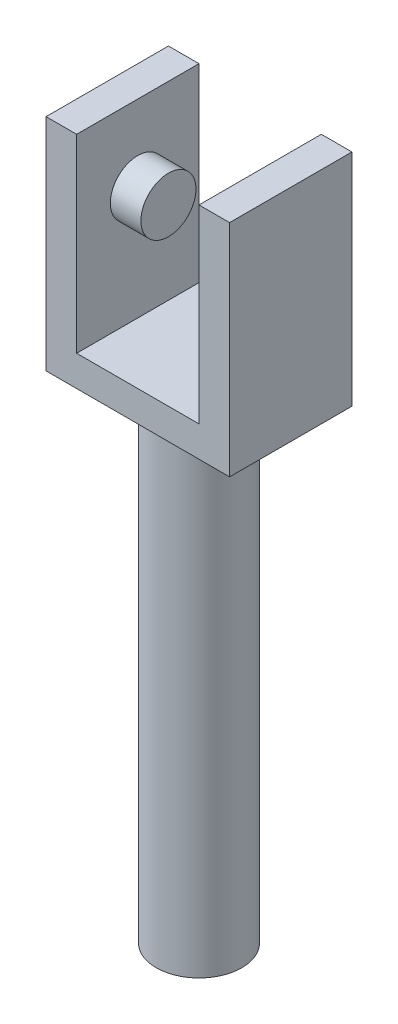
ISO-10303-21;
HEADER;
FILE_DESCRIPTION(('STEP AP214'),'2;1');
FILE_NAME('part.step','',(''),(''),'','','');
FILE_SCHEMA(('AUTOMOTIVE_DESIGN { 1 0 10303 214 1 1 1 1 }'));
ENDSEC;
DATA;
#1=APPLICATION_CONTEXT('core data for automotive mechanical design processes');
#2=APPLICATION_PROTOCOL_DEFINITION('international standard','automotive_design',2000,#1);
#3=PRODUCT_CONTEXT('',#1,'mechanical');
#4=PRODUCT('Part','Part','',(#3));
#5=PRODUCT_RELATED_PRODUCT_CATEGORY('part','',(#4));
#6=PRODUCT_DEFINITION_FORMATION('','',#4);
#7=PRODUCT_DEFINITION_CONTEXT('part definition',#1,'design');
#8=PRODUCT_DEFINITION('design','',#6,#7);
#9=PRODUCT_DEFINITION_SHAPE('','',#8);
#10=(LENGTH_UNIT() NAMED_UNIT(*) SI_UNIT(.MILLI.,.METRE.));
#11=(NAMED_UNIT(*) PLANE_ANGLE_UNIT() SI_UNIT($,.RADIAN.));
#12=(NAMED_UNIT(*) SI_UNIT($,.STERADIAN.) SOLID_ANGLE_UNIT());
#13=UNCERTAINTY_MEASURE_WITH_UNIT(LENGTH_MEASURE(1.E-05),#10,'distance_accuracy_value','');
#14=(GEOMETRIC_REPRESENTATION_CONTEXT(3) GLOBAL_UNCERTAINTY_ASSIGNED_CONTEXT((#13)) GLOBAL_UNIT_ASSIGNED_CONTEXT((#10,
#11,#12)) REPRESENTATION_CONTEXT('',''));
#15=CARTESIAN_POINT('',(0.,0.,0.));
#16=DIRECTION('',(0.,0.,1.));
#17=DIRECTION('',(1.,0.,0.));
#18=AXIS2_PLACEMENT_3D('',#15,#16,#17);
#19=CARTESIAN_POINT('',(0.,572.5,0.));
#20=DIRECTION('',(0.,1.,0.));
#21=DIRECTION('',(0.,0.,1.));
#22=AXIS2_PLACEMENT_3D('',#19,#20,#21);
#23=PLANE('',#22);
#24=DIRECTION('',(0.,0.,-1.));
#25=VECTOR('',#24,1.);
#26=CARTESIAN_POINT('',(50.,572.5,0.));
#27=LINE('',#26,#25);
#28=CARTESIAN_POINT('',(50.,572.5,50.));
#29=VERTEX_POINT('',#28);
#30=CARTESIAN_POINT('',(50.,572.5,-50.));
#31=VERTEX_POINT('',#30);
#32=EDGE_CURVE('E215',#29,#31,#27,.T.);
#33=ORIENTED_EDGE('',*,*,#32,.F.);
#34=DIRECTION('',(1.,0.,0.));
#35=VECTOR('',#34,1.);
#36=CARTESIAN_POINT('',(-75.,572.5,50.));
#37=LINE('',#36,#35);
#38=CARTESIAN_POINT('',(75.,572.5,50.));
#39=VERTEX_POINT('',#38);
#40=EDGE_CURVE('E70',#29,#39,#37,.T.);
#41=ORIENTED_EDGE('',*,*,#40,.T.);
#42=DIRECTION('',(0.,0.,-1.));
#43=VECTOR('',#42,1.);
#44=CARTESIAN_POINT('',(75.,572.5,-50.));
#45=LINE('',#44,#43);
#46=CARTESIAN_POINT('',(75.,572.5,-50.));
#47=VERTEX_POINT('',#46);
#48=EDGE_CURVE('E168',#39,#47,#45,.T.);
#49=ORIENTED_EDGE('',*,*,#48,.T.);
#50=DIRECTION('',(-1.,0.,0.));
#51=VECTOR('',#50,1.);
#52=CARTESIAN_POINT('',(-75.,572.5,-50.));
#53=LINE('',#52,#51);
#54=EDGE_CURVE('E100',#47,#31,#53,.T.);
#55=ORIENTED_EDGE('',*,*,#54,.T.);
#56=EDGE_LOOP('',(#33,#41,#49,#55));
#57=FACE_BOUND('',#56,.T.);
#58=ADVANCED_FACE('F45',(#57),#23,.T.);
#59=CARTESIAN_POINT('',(0.,392.5,0.));
#60=DIRECTION('',(0.,-1.,0.));
#61=DIRECTION('',(0.,0.,-1.));
#62=AXIS2_PLACEMENT_3D('',#59,#60,#61);
#63=CYLINDRICAL_SURFACE('',#62,35.);
#64=CARTESIAN_POINT('',(0.,392.5,0.));
#65=DIRECTION('',(0.,1.,0.));
#66=DIRECTION('',(0.,0.,1.));
#67=AXIS2_PLACEMENT_3D('',#64,#65,#66);
#68=CIRCLE('',#67,35.);
#69=CARTESIAN_POINT('',(0.,392.5,35.));
#70=VERTEX_POINT('',#69);
#71=EDGE_CURVE('E205',#70,#70,#68,.T.);
#72=ORIENTED_EDGE('',*,*,#71,.F.);
#73=EDGE_LOOP('',(#72));
#74=FACE_BOUND('',#73,.T.);
#75=CARTESIAN_POINT('',(0.,0.,0.));
#76=DIRECTION('',(0.,1.,0.));
#77=DIRECTION('',(0.,0.,1.));
#78=AXIS2_PLACEMENT_3D('',#75,#76,#77);
#79=CIRCLE('',#78,35.);
#80=CARTESIAN_POINT('',(0.,0.,35.));
#81=VERTEX_POINT('',#80);
#82=EDGE_CURVE('E204',#81,#81,#79,.T.);
#83=ORIENTED_EDGE('',*,*,#82,.T.);
#84=EDGE_LOOP('',(#83));
#85=FACE_BOUND('',#84,.T.);
#86=ADVANCED_FACE('F47',(#74,#85),#63,.T.);
#87=CARTESIAN_POINT('',(0.,0.,0.));
#88=DIRECTION('',(0.,1.,0.));
#89=DIRECTION('',(0.,0.,1.));
#90=AXIS2_PLACEMENT_3D('',#87,#88,#89);
#91=PLANE('',#90);
#92=ORIENTED_EDGE('',*,*,#82,.F.);
#93=EDGE_LOOP('',(#92));
#94=FACE_BOUND('',#93,.T.);
#95=ADVANCED_FACE('F255',(#94),#91,.F.);
#96=CARTESIAN_POINT('',(75.,572.5,-50.));
#97=DIRECTION('',(-1.,0.,0.));
#98=DIRECTION('',(0.,0.,1.));
#99=AXIS2_PLACEMENT_3D('',#96,#97,#98);
#100=PLANE('',#99);
#101=DIRECTION('',(0.,0.,-1.));
#102=VECTOR('',#101,1.);
#103=CARTESIAN_POINT('',(75.,392.5,-50.));
#104=LINE('',#103,#102);
#105=CARTESIAN_POINT('',(75.,392.5,50.));
#106=VERTEX_POINT('',#105);
#107=CARTESIAN_POINT('',(75.,392.5,-50.));
#108=VERTEX_POINT('',#107);
#109=EDGE_CURVE('E167',#106,#108,#104,.T.);
#110=ORIENTED_EDGE('',*,*,#109,.T.);
#111=DIRECTION('',(0.,-1.,0.));
#112=VECTOR('',#111,1.);
#113=CARTESIAN_POINT('',(75.,572.5,-50.));
#114=LINE('',#113,#112);
#115=EDGE_CURVE('E201',#47,#108,#114,.T.);
#116=ORIENTED_EDGE('',*,*,#115,.F.);
#117=ORIENTED_EDGE('',*,*,#48,.F.);
#118=DIRECTION('',(0.,-1.,0.));
#119=VECTOR('',#118,1.);
#120=CARTESIAN_POINT('',(75.,572.5,50.));
#121=LINE('',#120,#119);
#122=EDGE_CURVE('E180',#39,#106,#121,.T.);
#123=ORIENTED_EDGE('',*,*,#122,.T.);
#124=EDGE_LOOP('',(#110,#116,#117,#123));
#125=FACE_BOUND('',#124,.T.);
#126=ADVANCED_FACE('F231',(#125),#100,.F.);
#127=CARTESIAN_POINT('',(-75.,572.5,-50.));
#128=DIRECTION('',(0.,0.,1.));
#129=DIRECTION('',(1.,0.,0.));
#130=AXIS2_PLACEMENT_3D('',#127,#128,#129);
#131=PLANE('',#130);
#132=DIRECTION('',(0.,-1.,0.));
#133=VECTOR('',#132,1.);
#134=CARTESIAN_POINT('',(-50.,572.5,-50.));
#135=LINE('',#134,#133);
#136=CARTESIAN_POINT('',(-50.,572.5,-50.));
#137=VERTEX_POINT('',#136);
#138=CARTESIAN_POINT('',(-50.,417.5,-50.));
#139=VERTEX_POINT('',#138);
#140=EDGE_CURVE('E61',#137,#139,#135,.T.);
#141=ORIENTED_EDGE('',*,*,#140,.T.);
#142=DIRECTION('',(1.,0.,0.));
#143=VECTOR('',#142,1.);
#144=CARTESIAN_POINT('',(-50.,417.5,-50.));
#145=LINE('',#144,#143);
#146=CARTESIAN_POINT('',(50.,417.5,-50.));
#147=VERTEX_POINT('',#146);
#148=EDGE_CURVE('E124',#139,#147,#145,.T.);
#149=ORIENTED_EDGE('',*,*,#148,.T.);
#150=DIRECTION('',(0.,1.,0.));
#151=VECTOR('',#150,1.);
#152=CARTESIAN_POINT('',(50.,572.5,-50.));
#153=LINE('',#152,#151);
#154=EDGE_CURVE('E128',#147,#31,#153,.T.);
#155=ORIENTED_EDGE('',*,*,#154,.T.);
#156=ORIENTED_EDGE('',*,*,#54,.F.);
#157=ORIENTED_EDGE('',*,*,#115,.T.);
#158=DIRECTION('',(-1.,0.,0.));
#159=VECTOR('',#158,1.);
#160=CARTESIAN_POINT('',(-75.,392.5,-50.));
#161=LINE('',#160,#159);
#162=CARTESIAN_POINT('',(-75.,392.5,-50.));
#163=VERTEX_POINT('',#162);
#164=EDGE_CURVE('E184',#108,#163,#161,.T.);
#165=ORIENTED_EDGE('',*,*,#164,.T.);
#166=DIRECTION('',(0.,-1.,0.));
#167=VECTOR('',#166,1.);
#168=CARTESIAN_POINT('',(-75.,572.5,-50.));
#169=LINE('',#168,#167);
#170=CARTESIAN_POINT('',(-75.,572.5,-50.));
#171=VERTEX_POINT('',#170);
#172=EDGE_CURVE('E197',#171,#163,#169,.T.);
#173=ORIENTED_EDGE('',*,*,#172,.F.);
#174=EDGE_CURVE('E126',#137,#171,#53,.T.);
#175=ORIENTED_EDGE('',*,*,#174,.F.);
#176=EDGE_LOOP('',(#141,#149,#155,#156,#157,#165,#173,#175));
#177=FACE_BOUND('',#176,.T.);
#178=ADVANCED_FACE('F122',(#177),#131,.F.);
#179=CARTESIAN_POINT('',(-75.,572.5,-50.));
#180=DIRECTION('',(1.,0.,0.));
#181=DIRECTION('',(0.,0.,-1.));
#182=AXIS2_PLACEMENT_3D('',#179,#180,#181);
#183=PLANE('',#182);
#184=DIRECTION('',(0.,0.,1.));
#185=VECTOR('',#184,1.);
#186=CARTESIAN_POINT('',(-75.,392.5,-50.));
#187=LINE('',#186,#185);
#188=CARTESIAN_POINT('',(-75.,392.5,50.));
#189=VERTEX_POINT('',#188);
#190=EDGE_CURVE('E187',#163,#189,#187,.T.);
#191=ORIENTED_EDGE('',*,*,#190,.T.);
#192=DIRECTION('',(0.,-1.,0.));
#193=VECTOR('',#192,1.);
#194=CARTESIAN_POINT('',(-75.,572.5,50.));
#195=LINE('',#194,#193);
#196=CARTESIAN_POINT('',(-75.,572.5,50.));
#197=VERTEX_POINT('',#196);
#198=EDGE_CURVE('E194',#197,#189,#195,.T.);
#199=ORIENTED_EDGE('',*,*,#198,.F.);
#200=DIRECTION('',(0.,0.,1.));
#201=VECTOR('',#200,1.);
#202=CARTESIAN_POINT('',(-75.,572.5,-50.));
#203=LINE('',#202,#201);
#204=EDGE_CURVE('E173',#171,#197,#203,.T.);
#205=ORIENTED_EDGE('',*,*,#204,.F.);
#206=ORIENTED_EDGE('',*,*,#172,.T.);
#207=EDGE_LOOP('',(#191,#199,#205,#206));
#208=FACE_BOUND('',#207,.T.);
#209=ADVANCED_FACE('F237',(#208),#183,.F.);
#210=CARTESIAN_POINT('',(-75.,572.5,50.));
#211=DIRECTION('',(0.,0.,-1.));
#212=DIRECTION('',(-1.,0.,0.));
#213=AXIS2_PLACEMENT_3D('',#210,#211,#212);
#214=PLANE('',#213);
#215=DIRECTION('',(1.,0.,0.));
#216=VECTOR('',#215,1.);
#217=CARTESIAN_POINT('',(-50.,417.5,50.));
#218=LINE('',#217,#216);
#219=CARTESIAN_POINT('',(-50.,417.5,50.));
#220=VERTEX_POINT('',#219);
#221=CARTESIAN_POINT('',(50.,417.5,50.));
#222=VERTEX_POINT('',#221);
#223=EDGE_CURVE('E146',#220,#222,#218,.T.);
#224=ORIENTED_EDGE('',*,*,#223,.F.);
#225=DIRECTION('',(0.,-1.,0.));
#226=VECTOR('',#225,1.);
#227=CARTESIAN_POINT('',(-50.,572.5,50.));
#228=LINE('',#227,#226);
#229=CARTESIAN_POINT('',(-50.,572.5,50.));
#230=VERTEX_POINT('',#229);
#231=EDGE_CURVE('E135',#230,#220,#228,.T.);
#232=ORIENTED_EDGE('',*,*,#231,.F.);
#233=EDGE_CURVE('E176',#197,#230,#37,.T.);
#234=ORIENTED_EDGE('',*,*,#233,.F.);
#235=ORIENTED_EDGE('',*,*,#198,.T.);
#236=DIRECTION('',(1.,0.,0.));
#237=VECTOR('',#236,1.);
#238=CARTESIAN_POINT('',(-75.,392.5,50.));
#239=LINE('',#238,#237);
#240=EDGE_CURVE('E92',#189,#106,#239,.T.);
#241=ORIENTED_EDGE('',*,*,#240,.T.);
#242=ORIENTED_EDGE('',*,*,#122,.F.);
#243=ORIENTED_EDGE('',*,*,#40,.F.);
#244=DIRECTION('',(0.,1.,0.));
#245=VECTOR('',#244,1.);
#246=CARTESIAN_POINT('',(50.,447.5,50.));
#247=LINE('',#246,#245);
#248=EDGE_CURVE('E129',#222,#29,#247,.T.);
#249=ORIENTED_EDGE('',*,*,#248,.F.);
#250=EDGE_LOOP('',(#224,#232,#234,#235,#241,#242,#243,#249));
#251=FACE_BOUND('',#250,.T.);
#252=ADVANCED_FACE('F248',(#251),#214,.F.);
#253=DIRECTION('',(0.,0.,1.));
#254=VECTOR('',#253,1.);
#255=CARTESIAN_POINT('',(-50.,572.5,0.));
#256=LINE('',#255,#254);
#257=EDGE_CURVE('E209',#137,#230,#256,.T.);
#258=ORIENTED_EDGE('',*,*,#257,.F.);
#259=ORIENTED_EDGE('',*,*,#174,.T.);
#260=ORIENTED_EDGE('',*,*,#204,.T.);
#261=ORIENTED_EDGE('',*,*,#233,.T.);
#262=EDGE_LOOP('',(#258,#259,#260,#261));
#263=FACE_BOUND('',#262,.T.);
#264=ADVANCED_FACE('F240',(#263),#23,.T.);
#265=CARTESIAN_POINT('',(0.,392.5,0.));
#266=DIRECTION('',(0.,1.,0.));
#267=DIRECTION('',(0.,0.,1.));
#268=AXIS2_PLACEMENT_3D('',#265,#266,#267);
#269=PLANE('',#268);
#270=ORIENTED_EDGE('',*,*,#71,.T.);
#271=EDGE_LOOP('',(#270));
#272=FACE_BOUND('',#271,.T.);
#273=ORIENTED_EDGE('',*,*,#109,.F.);
#274=ORIENTED_EDGE('',*,*,#240,.F.);
#275=ORIENTED_EDGE('',*,*,#190,.F.);
#276=ORIENTED_EDGE('',*,*,#164,.F.);
#277=EDGE_LOOP('',(#273,#274,#275,#276));
#278=FACE_BOUND('',#277,.T.);
#279=ADVANCED_FACE('F226',(#272,#278),#269,.F.);
#280=CARTESIAN_POINT('',(50.,447.5,-100.));
#281=DIRECTION('',(1.,0.,0.));
#282=DIRECTION('',(0.,1.,0.));
#283=AXIS2_PLACEMENT_3D('',#280,#281,#282);
#284=PLANE('',#283);
#285=CARTESIAN_POINT('',(50.,510.,0.));
#286=DIRECTION('',(1.,0.,0.));
#287=DIRECTION('',(0.,1.,0.));
#288=AXIS2_PLACEMENT_3D('',#285,#286,#287);
#289=CIRCLE('',#288,22.5);
#290=CARTESIAN_POINT('',(50.,532.5,0.));
#291=VERTEX_POINT('',#290);
#292=EDGE_CURVE('E54',#291,#291,#289,.F.);
#293=ORIENTED_EDGE('',*,*,#292,.F.);
#294=EDGE_LOOP('',(#293));
#295=FACE_BOUND('',#294,.T.);
#296=ORIENTED_EDGE('',*,*,#154,.F.);
#297=DIRECTION('',(0.,0.,1.));
#298=VECTOR('',#297,1.);
#299=CARTESIAN_POINT('',(50.,417.5,-50.));
#300=LINE('',#299,#298);
#301=EDGE_CURVE('E140',#147,#222,#300,.T.);
#302=ORIENTED_EDGE('',*,*,#301,.T.);
#303=ORIENTED_EDGE('',*,*,#248,.T.);
#304=ORIENTED_EDGE('',*,*,#32,.T.);
#305=EDGE_LOOP('',(#296,#302,#303,#304));
#306=FACE_BOUND('',#305,.T.);
#307=ADVANCED_FACE('F223',(#295,#306),#284,.F.);
#308=CARTESIAN_POINT('',(-50.,572.5,-100.));
#309=DIRECTION('',(-1.,0.,0.));
#310=DIRECTION('',(0.,-1.,0.));
#311=AXIS2_PLACEMENT_3D('',#308,#309,#310);
#312=PLANE('',#311);
#313=CARTESIAN_POINT('',(-50.,510.,0.));
#314=DIRECTION('',(-1.,0.,0.));
#315=DIRECTION('',(0.,-1.,0.));
#316=AXIS2_PLACEMENT_3D('',#313,#314,#315);
#317=CIRCLE('',#316,22.5);
#318=CARTESIAN_POINT('',(-50.,487.5,0.));
#319=VERTEX_POINT('',#318);
#320=EDGE_CURVE('E11',#319,#319,#317,.F.);
#321=ORIENTED_EDGE('',*,*,#320,.F.);
#322=EDGE_LOOP('',(#321));
#323=FACE_BOUND('',#322,.T.);
#324=ORIENTED_EDGE('',*,*,#257,.T.);
#325=ORIENTED_EDGE('',*,*,#231,.T.);
#326=DIRECTION('',(0.,0.,1.));
#327=VECTOR('',#326,1.);
#328=CARTESIAN_POINT('',(-50.,417.5,-50.));
#329=LINE('',#328,#327);
#330=EDGE_CURVE('E132',#139,#220,#329,.T.);
#331=ORIENTED_EDGE('',*,*,#330,.F.);
#332=ORIENTED_EDGE('',*,*,#140,.F.);
#333=EDGE_LOOP('',(#324,#325,#331,#332));
#334=FACE_BOUND('',#333,.T.);
#335=ADVANCED_FACE('F133',(#323,#334),#312,.F.);
#336=CARTESIAN_POINT('',(25.,510.,0.));
#337=DIRECTION('',(1.,0.,0.));
#338=DIRECTION('',(0.,0.,-1.));
#339=AXIS2_PLACEMENT_3D('',#336,#337,#338);
#340=CYLINDRICAL_SURFACE('',#339,22.5);
#341=CARTESIAN_POINT('',(25.,510.,0.));
#342=DIRECTION('',(-1.,0.,0.));
#343=DIRECTION('',(0.,0.,1.));
#344=AXIS2_PLACEMENT_3D('',#341,#342,#343);
#345=CIRCLE('',#344,22.5);
#346=CARTESIAN_POINT('',(25.,510.,22.5));
#347=VERTEX_POINT('',#346);
#348=EDGE_CURVE('E157',#347,#347,#345,.T.);
#349=ORIENTED_EDGE('',*,*,#348,.F.);
#350=EDGE_LOOP('',(#349));
#351=FACE_BOUND('',#350,.T.);
#352=ORIENTED_EDGE('',*,*,#292,.T.);
#353=EDGE_LOOP('',(#352));
#354=FACE_BOUND('',#353,.T.);
#355=ADVANCED_FACE('F221',(#351,#354),#340,.T.);
#356=CARTESIAN_POINT('',(25.,510.,0.));
#357=DIRECTION('',(-1.,0.,0.));
#358=DIRECTION('',(0.,0.,1.));
#359=AXIS2_PLACEMENT_3D('',#356,#357,#358);
#360=PLANE('',#359);
#361=ORIENTED_EDGE('',*,*,#348,.T.);
#362=EDGE_LOOP('',(#361));
#363=FACE_BOUND('',#362,.T.);
#364=ADVANCED_FACE('F263',(#363),#360,.T.);
#365=CARTESIAN_POINT('',(-24.9999999999999,510.,0.));
#366=DIRECTION('',(-1.,0.,0.));
#367=DIRECTION('',(0.,-1.,0.));
#368=AXIS2_PLACEMENT_3D('',#365,#366,#367);
#369=CYLINDRICAL_SURFACE('',#368,22.5);
#370=CARTESIAN_POINT('',(-24.9999999999999,510.,0.));
#371=DIRECTION('',(1.,0.,0.));
#372=DIRECTION('',(0.,1.,0.));
#373=AXIS2_PLACEMENT_3D('',#370,#371,#372);
#374=CIRCLE('',#373,22.5);
#375=CARTESIAN_POINT('',(-24.9999999999999,532.5,0.));
#376=VERTEX_POINT('',#375);
#377=EDGE_CURVE('E152',#376,#376,#374,.T.);
#378=ORIENTED_EDGE('',*,*,#377,.F.);
#379=EDGE_LOOP('',(#378));
#380=FACE_BOUND('',#379,.T.);
#381=ORIENTED_EDGE('',*,*,#320,.T.);
#382=EDGE_LOOP('',(#381));
#383=FACE_BOUND('',#382,.T.);
#384=ADVANCED_FACE('F267',(#380,#383),#369,.T.);
#385=CARTESIAN_POINT('',(-24.9999999999999,510.,0.));
#386=DIRECTION('',(1.,0.,0.));
#387=DIRECTION('',(0.,1.,0.));
#388=AXIS2_PLACEMENT_3D('',#385,#386,#387);
#389=PLANE('',#388);
#390=ORIENTED_EDGE('',*,*,#377,.T.);
#391=EDGE_LOOP('',(#390));
#392=FACE_BOUND('',#391,.T.);
#393=ADVANCED_FACE('F271',(#392),#389,.T.);
#394=CARTESIAN_POINT('',(-50.,417.5,-50.));
#395=DIRECTION('',(0.,-1.,0.));
#396=DIRECTION('',(0.,0.,-1.));
#397=AXIS2_PLACEMENT_3D('',#394,#395,#396);
#398=PLANE('',#397);
#399=ORIENTED_EDGE('',*,*,#223,.T.);
#400=ORIENTED_EDGE('',*,*,#301,.F.);
#401=ORIENTED_EDGE('',*,*,#148,.F.);
#402=ORIENTED_EDGE('',*,*,#330,.T.);
#403=EDGE_LOOP('',(#399,#400,#401,#402));
#404=FACE_BOUND('',#403,.T.);
#405=ADVANCED_FACE('F143',(#404),#398,.F.);
#406=CLOSED_SHELL('',(#58,#86,#95,#126,#178,#209,#252,#264,#279,#307,#335,#355,#364,#384,#393,#405));
#407=MANIFOLD_SOLID_BREP('B2',#406);
#408=ADVANCED_BREP_SHAPE_REPRESENTATION('',(#18,#407),#14);
#409=SHAPE_DEFINITION_REPRESENTATION(#9,#408);
ENDSEC;
END-ISO-10303-21;
